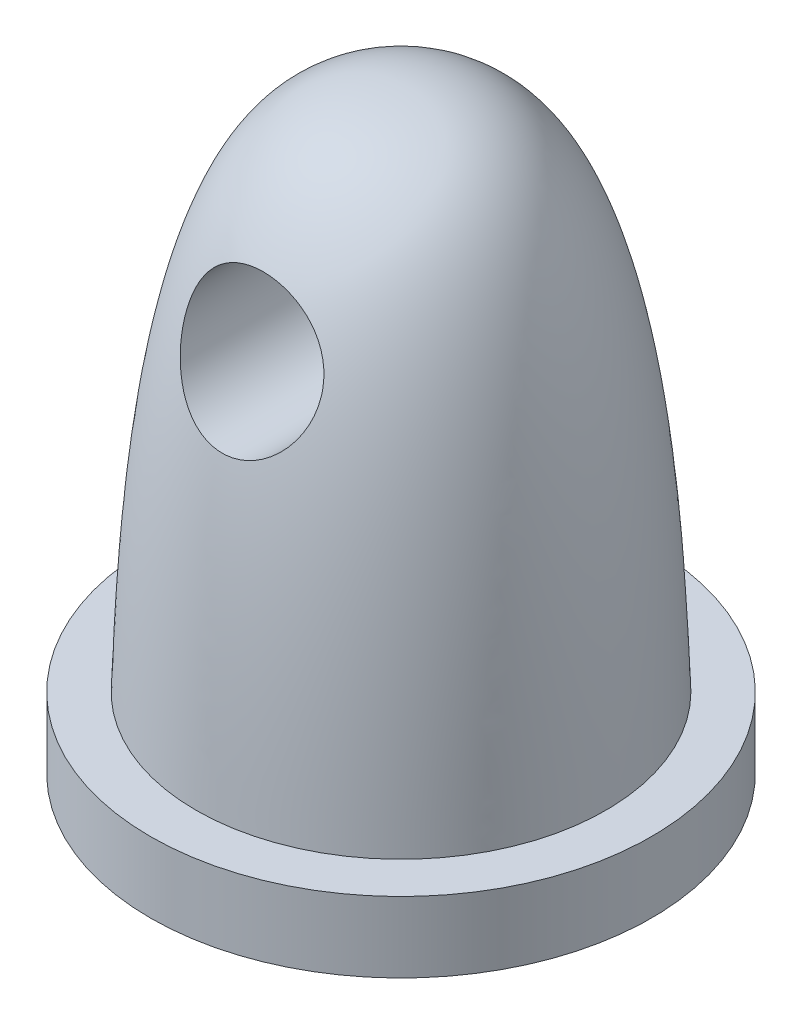
ISO-10303-21;
HEADER;
FILE_DESCRIPTION(('STEP AP214'),'2;1');
FILE_NAME('part.step','',(''),(''),'','','');
FILE_SCHEMA(('AUTOMOTIVE_DESIGN { 1 0 10303 214 1 1 1 1 }'));
ENDSEC;
DATA;
#1=APPLICATION_CONTEXT('core data for automotive mechanical design processes');
#2=APPLICATION_PROTOCOL_DEFINITION('international standard','automotive_design',2000,#1);
#3=PRODUCT_CONTEXT('',#1,'mechanical');
#4=PRODUCT('Part','Part','',(#3));
#5=PRODUCT_RELATED_PRODUCT_CATEGORY('part','',(#4));
#6=PRODUCT_DEFINITION_FORMATION('','',#4);
#7=PRODUCT_DEFINITION_CONTEXT('part definition',#1,'design');
#8=PRODUCT_DEFINITION('design','',#6,#7);
#9=PRODUCT_DEFINITION_SHAPE('','',#8);
#10=(LENGTH_UNIT() NAMED_UNIT(*) SI_UNIT(.MILLI.,.METRE.));
#11=(NAMED_UNIT(*) PLANE_ANGLE_UNIT() SI_UNIT($,.RADIAN.));
#12=(NAMED_UNIT(*) SI_UNIT($,.STERADIAN.) SOLID_ANGLE_UNIT());
#13=UNCERTAINTY_MEASURE_WITH_UNIT(LENGTH_MEASURE(1.E-05),#10,'distance_accuracy_value','');
#14=(GEOMETRIC_REPRESENTATION_CONTEXT(3) GLOBAL_UNCERTAINTY_ASSIGNED_CONTEXT((#13)) GLOBAL_UNIT_ASSIGNED_CONTEXT((#10,
#11,#12)) REPRESENTATION_CONTEXT('',''));
#15=CARTESIAN_POINT('',(0.,0.,0.));
#16=DIRECTION('',(0.,0.,1.));
#17=DIRECTION('',(1.,0.,0.));
#18=AXIS2_PLACEMENT_3D('',#15,#16,#17);
#19=CARTESIAN_POINT('',(0.,1.55,0.));
#20=DIRECTION('',(0.,1.,0.));
#21=DIRECTION('',(0.,0.,1.));
#22=AXIS2_PLACEMENT_3D('',#19,#20,#21);
#23=PLANE('',#22);
#24=CARTESIAN_POINT('',(0.,1.55,0.));
#25=DIRECTION('',(0.,1.,0.));
#26=DIRECTION('',(0.,0.,1.));
#27=AXIS2_PLACEMENT_3D('',#24,#25,#26);
#28=CIRCLE('',#27,5.5);
#29=CARTESIAN_POINT('',(0.,1.55,-5.5));
#30=VERTEX_POINT('',#29);
#31=EDGE_CURVE('E11',#30,#30,#28,.T.);
#32=ORIENTED_EDGE('',*,*,#31,.T.);
#33=EDGE_LOOP('',(#32));
#34=FACE_BOUND('',#33,.T.);
#35=CARTESIAN_POINT('',(0.,1.55,0.));
#36=DIRECTION('',(0.,1.,0.));
#37=DIRECTION('',(0.,0.,1.));
#38=AXIS2_PLACEMENT_3D('',#35,#36,#37);
#39=CIRCLE('',#38,4.5);
#40=CARTESIAN_POINT('',(0.,1.55,4.5));
#41=VERTEX_POINT('',#40);
#42=EDGE_CURVE('E57',#41,#41,#39,.T.);
#43=ORIENTED_EDGE('',*,*,#42,.F.);
#44=EDGE_LOOP('',(#43));
#45=FACE_BOUND('',#44,.T.);
#46=ADVANCED_FACE('F33',(#34,#45),#23,.T.);
#47=CARTESIAN_POINT('',(0.,1.55,0.));
#48=DIRECTION('',(0.,-1.,0.));
#49=DIRECTION('',(0.,0.,-1.));
#50=AXIS2_PLACEMENT_3D('',#47,#48,#49);
#51=CYLINDRICAL_SURFACE('',#50,5.5);
#52=CARTESIAN_POINT('',(0.,0.,0.));
#53=DIRECTION('',(0.,1.,0.));
#54=DIRECTION('',(0.,0.,1.));
#55=AXIS2_PLACEMENT_3D('',#52,#53,#54);
#56=CIRCLE('',#55,5.5);
#57=CARTESIAN_POINT('',(0.,0.,-5.5));
#58=VERTEX_POINT('',#57);
#59=EDGE_CURVE('E45',#58,#58,#56,.T.);
#60=CARTESIAN_POINT('',(0.,1.55,-5.5));
#61=CARTESIAN_POINT('',(0.,1.53385416666667,-5.5));
#62=CARTESIAN_POINT('',(0.,1.51770833333333,-5.5));
#63=CARTESIAN_POINT('',(0.,1.48541666666667,-5.5));
#64=CARTESIAN_POINT('',(0.,1.46927083333333,-5.5));
#65=CARTESIAN_POINT('',(0.,1.43697916666667,-5.5));
#66=CARTESIAN_POINT('',(0.,1.42083333333333,-5.5));
#67=CARTESIAN_POINT('',(0.,1.38854166666667,-5.5));
#68=CARTESIAN_POINT('',(0.,1.37239583333333,-5.5));
#69=CARTESIAN_POINT('',(0.,1.34010416666667,-5.5));
#70=CARTESIAN_POINT('',(0.,1.32395833333333,-5.5));
#71=CARTESIAN_POINT('',(0.,1.29166666666667,-5.5));
#72=CARTESIAN_POINT('',(0.,1.27552083333333,-5.5));
#73=CARTESIAN_POINT('',(0.,1.24322916666667,-5.5));
#74=CARTESIAN_POINT('',(0.,1.22708333333333,-5.5));
#75=CARTESIAN_POINT('',(0.,1.19479166666667,-5.5));
#76=CARTESIAN_POINT('',(0.,1.17864583333333,-5.5));
#77=CARTESIAN_POINT('',(0.,1.14635416666667,-5.5));
#78=CARTESIAN_POINT('',(0.,1.13020833333333,-5.5));
#79=CARTESIAN_POINT('',(0.,1.09791666666667,-5.5));
#80=CARTESIAN_POINT('',(0.,1.08177083333333,-5.5));
#81=CARTESIAN_POINT('',(0.,1.04947916666667,-5.5));
#82=CARTESIAN_POINT('',(0.,1.03333333333333,-5.5));
#83=CARTESIAN_POINT('',(0.,1.00104166666667,-5.5));
#84=CARTESIAN_POINT('',(0.,0.984895833333333,-5.5));
#85=CARTESIAN_POINT('',(0.,0.952604166666667,-5.5));
#86=CARTESIAN_POINT('',(0.,0.936458333333333,-5.5));
#87=CARTESIAN_POINT('',(0.,0.904166666666667,-5.5));
#88=CARTESIAN_POINT('',(0.,0.888020833333333,-5.5));
#89=CARTESIAN_POINT('',(0.,0.855729166666667,-5.5));
#90=CARTESIAN_POINT('',(0.,0.839583333333333,-5.5));
#91=CARTESIAN_POINT('',(0.,0.807291666666667,-5.5));
#92=CARTESIAN_POINT('',(0.,0.791145833333333,-5.5));
#93=CARTESIAN_POINT('',(0.,0.758854166666667,-5.5));
#94=CARTESIAN_POINT('',(0.,0.742708333333333,-5.5));
#95=CARTESIAN_POINT('',(0.,0.710416666666667,-5.5));
#96=CARTESIAN_POINT('',(0.,0.694270833333333,-5.5));
#97=CARTESIAN_POINT('',(0.,0.661979166666667,-5.5));
#98=CARTESIAN_POINT('',(0.,0.645833333333333,-5.5));
#99=CARTESIAN_POINT('',(0.,0.613541666666667,-5.5));
#100=CARTESIAN_POINT('',(0.,0.597395833333333,-5.5));
#101=CARTESIAN_POINT('',(0.,0.565104166666667,-5.5));
#102=CARTESIAN_POINT('',(0.,0.548958333333333,-5.5));
#103=CARTESIAN_POINT('',(0.,0.516666666666667,-5.5));
#104=CARTESIAN_POINT('',(0.,0.500520833333333,-5.5));
#105=CARTESIAN_POINT('',(0.,0.468229166666667,-5.5));
#106=CARTESIAN_POINT('',(0.,0.452083333333333,-5.5));
#107=CARTESIAN_POINT('',(0.,0.419791666666667,-5.5));
#108=CARTESIAN_POINT('',(0.,0.403645833333333,-5.5));
#109=CARTESIAN_POINT('',(0.,0.371354166666667,-5.5));
#110=CARTESIAN_POINT('',(0.,0.355208333333333,-5.5));
#111=CARTESIAN_POINT('',(0.,0.322916666666667,-5.5));
#112=CARTESIAN_POINT('',(0.,0.306770833333333,-5.5));
#113=CARTESIAN_POINT('',(0.,0.274479166666667,-5.5));
#114=CARTESIAN_POINT('',(0.,0.258333333333333,-5.5));
#115=CARTESIAN_POINT('',(0.,0.226041666666667,-5.5));
#116=CARTESIAN_POINT('',(0.,0.209895833333333,-5.5));
#117=CARTESIAN_POINT('',(0.,0.177604166666667,-5.5));
#118=CARTESIAN_POINT('',(0.,0.161458333333333,-5.5));
#119=CARTESIAN_POINT('',(0.,0.129166666666667,-5.5));
#120=CARTESIAN_POINT('',(0.,0.113020833333333,-5.5));
#121=CARTESIAN_POINT('',(0.,0.0807291666666667,-5.5));
#122=CARTESIAN_POINT('',(0.,0.0645833333333334,-5.5));
#123=CARTESIAN_POINT('',(0.,0.0322916666666667,-5.5));
#124=CARTESIAN_POINT('',(0.,0.0161458333333334,-5.5));
#125=CARTESIAN_POINT('',(0.,0.,-5.5));
#126=B_SPLINE_CURVE_WITH_KNOTS('',3,(#60,#61,#62,#63,#64,#65,#66,#67,#68,#69,#70,#71,#72,#73,
#74,#75,#76,#77,#78,#79,#80,#81,#82,#83,#84,#85,#86,#87,#88,#89,#90,#91,#92,#93,#94,#95,#96,#97,
#98,#99,#100,#101,#102,#103,#104,#105,#106,#107,#108,#109,#110,#111,#112,#113,#114,#115,#116,
#117,#118,#119,#120,#121,#122,#123,#124,#125),.UNSPECIFIED.,.F.,.F.,(4,2,2,2,2,2,2,2,2,2,2,2,2,
2,2,2,2,2,2,2,2,2,2,2,2,2,2,2,2,2,2,2,4),(0.,0.0484375000000001,0.0968750000000002,0.1453125,
0.19375,0.2421875,0.290625,0.3390625,0.3875,0.4359375,0.484375,0.5328125,0.58125,0.6296875,
0.678125,0.7265625,0.775,0.8234375,0.871875,0.9203125,0.96875,1.0171875,1.065625,1.1140625,
1.1625,1.2109375,1.259375,1.3078125,1.35625,1.4046875,1.453125,1.5015625,1.55),.UNSPECIFIED.);
#127=EDGE_CURVE('BSEAM35',#30,#58,#126,.T.);
#128=ORIENTED_EDGE('',*,*,#31,.F.);
#129=ORIENTED_EDGE('',*,*,#59,.T.);
#130=ORIENTED_EDGE('',*,*,#127,.T.);
#131=ORIENTED_EDGE('',*,*,#127,.F.);
#132=EDGE_LOOP('',(#128,#130,#129,#131));
#133=FACE_BOUND('',#132,.T.);
#134=ADVANCED_FACE('F35',(#133),#51,.T.);
#135=CARTESIAN_POINT('',(0.,0.,0.));
#136=DIRECTION('',(0.,1.,0.));
#137=DIRECTION('',(0.,0.,1.));
#138=AXIS2_PLACEMENT_3D('',#135,#136,#137);
#139=PLANE('',#138);
#140=ORIENTED_EDGE('',*,*,#59,.F.);
#141=EDGE_LOOP('',(#140));
#142=FACE_BOUND('',#141,.T.);
#143=ADVANCED_FACE('F53',(#142),#139,.F.);
#144=CARTESIAN_POINT('',(-4.5,1.55,0.));
#145=CARTESIAN_POINT('',(-4.41821284922061,3.53361375075111,0.));
#146=CARTESIAN_POINT('',(-4.25812384933478,10.3204827075285,0.));
#147=CARTESIAN_POINT('',(-1.72139415805613,13.0435728465028,0.));
#148=CARTESIAN_POINT('',(0.,13.05,0.));
#149=B_SPLINE_CURVE_WITH_KNOTS('',3,(#144,#145,#146,#147,#148),.UNSPECIFIED.,.F.,.F.,(4,1,4),
(0.,0.654562442987202,1.),.UNSPECIFIED.);
#150=CARTESIAN_POINT('',(0.,13.7025,0.));
#151=DIRECTION('',(0.,1.,0.));
#152=AXIS1_PLACEMENT('',#150,#151);
#153=SURFACE_OF_REVOLUTION('',#149,#152);
#154=CARTESIAN_POINT('',(1.5,9.55,-3.24777341395405));
#155=CARTESIAN_POINT('',(1.500000532154,9.63019520103539,-3.2226586680426));
#156=CARTESIAN_POINT('',(1.4935579381994,9.71096569009782,-3.19938463319633));
#157=CARTESIAN_POINT('',(1.46738959853547,9.87151715150215,-3.15731953986771));
#158=CARTESIAN_POINT('',(1.44767000870518,9.95129856497837,-3.13852640927981));
#159=CARTESIAN_POINT('',(1.39495737057765,10.1075912124798,-3.10573152383056));
#160=CARTESIAN_POINT('',(1.36193729323192,10.1840954342558,-3.09173963385722));
#161=CARTESIAN_POINT('',(1.28328617161267,10.3311051949352,-3.06838073062989));
#162=CARTESIAN_POINT('',(1.23765407299981,10.4016102316743,-3.05901410422104));
#163=CARTESIAN_POINT('',(1.13647274478337,10.5323819216922,-3.04438633292884));
#164=CARTESIAN_POINT('',(1.08123808734426,10.5928805362964,-3.03901725749909));
#165=CARTESIAN_POINT('',(0.961556072464706,10.7041611157343,-3.03101238849927));
#166=CARTESIAN_POINT('',(0.89710821794108,10.7549425559475,-3.02837674247034));
#167=CARTESIAN_POINT('',(0.759930884762748,10.8459017889838,-3.02479415988183));
#168=CARTESIAN_POINT('',(0.687109154882182,10.8859412306482,-3.02386842922822));
#169=CARTESIAN_POINT('',(0.535855759604821,10.9534668839033,-3.02286530307983));
#170=CARTESIAN_POINT('',(0.457423764890873,10.9809523578876,-3.02278795742565));
#171=CARTESIAN_POINT('',(0.295826995834769,11.0229441588308,-3.02284157992883));
#172=CARTESIAN_POINT('',(0.212606951103888,11.037238109558,-3.02297586551377));
#173=CARTESIAN_POINT('',(0.0449475748775569,11.0516857212175,-3.02311221451575));
#174=CARTESIAN_POINT('',(-0.0394917884810508,11.0518390119557,-3.02311427447121));
#175=CARTESIAN_POINT('',(-0.207401313283949,11.0379843664564,-3.02298233114689));
#176=CARTESIAN_POINT('',(-0.290868731829578,11.0239431612942,-3.02284800821095));
#177=CARTESIAN_POINT('',(-0.454265000823126,10.982046467125,-3.02278451576845));
#178=CARTESIAN_POINT('',(-0.534193715080112,10.9541904469424,-3.02285535415079));
#179=CARTESIAN_POINT('',(-0.68823459828978,10.8854571615469,-3.02387482507251));
#180=CARTESIAN_POINT('',(-0.762346988498024,10.8445803919488,-3.0248234242039));
#181=CARTESIAN_POINT('',(-0.902628608319037,10.7509869307529,-3.02855638368138));
#182=CARTESIAN_POINT('',(-0.968798190701592,10.6982707652857,-3.03134066246238));
#183=CARTESIAN_POINT('',(-1.09082455863859,10.5830028314934,-3.03983661136997));
#184=CARTESIAN_POINT('',(-1.14675153055095,10.5205238935134,-3.04552726132691));
#185=CARTESIAN_POINT('',(-1.24724638498735,10.3874512119155,-3.06082593157503));
#186=CARTESIAN_POINT('',(-1.2918170524515,10.3168594639996,-3.07043298992839));
#187=CARTESIAN_POINT('',(-1.36765521034472,10.171380428071,-3.09401145659171));
#188=CARTESIAN_POINT('',(-1.39917255283642,10.0966082886184,-3.10789106809502));
#189=CARTESIAN_POINT('',(-1.44959369194525,9.94388673142183,-3.14024499561525));
#190=CARTESIAN_POINT('',(-1.46849708144784,9.86593721121412,-3.15871945990433));
#191=CARTESIAN_POINT('',(-1.49374040392015,9.70856198832398,-3.20008003661477));
#192=CARTESIAN_POINT('',(-1.49998452302584,9.62912958652995,-3.22299836600654));
#193=CARTESIAN_POINT('',(-1.5000154336375,9.47138342410737,-3.27238781850977));
#194=CARTESIAN_POINT('',(-1.49379820731247,9.39307003247327,-3.2988600849265));
#195=CARTESIAN_POINT('',(-1.46866486825482,9.23380926559117,-3.3562742961421));
#196=CARTESIAN_POINT('',(-1.44888365539532,9.15306595099854,-3.38739982488685));
#197=CARTESIAN_POINT('',(-1.39654432867674,8.99638705484154,-3.45111845836726));
#198=CARTESIAN_POINT('',(-1.36398024269549,8.92045373978105,-3.4837122427578));
#199=CARTESIAN_POINT('',(-1.30456437247682,8.80831045184717,-3.53388257085314));
#200=CARTESIAN_POINT('',(-1.28192507045256,8.76983272053187,-3.55150127347521));
#201=CARTESIAN_POINT('',(-1.23327269632044,8.6949975041243,-3.58645043919698));
#202=CARTESIAN_POINT('',(-1.20726282164167,8.65863805635434,-3.60378115812798));
#203=CARTESIAN_POINT('',(-1.124270730952,8.55299004671783,-3.65501042294016));
#204=CARTESIAN_POINT('',(-1.06232128188497,8.48712280706061,-3.68815017458346));
#205=CARTESIAN_POINT('',(-0.926569030648553,8.36692186191459,-3.75011844289408));
#206=CARTESIAN_POINT('',(-0.852796588297662,8.31255942185014,-3.77895764610996));
#207=CARTESIAN_POINT('',(-0.694911296642607,8.2174988754252,-3.83022110559469));
#208=CARTESIAN_POINT('',(-0.610809039121409,8.17678692958493,-3.85265185560452));
#209=CARTESIAN_POINT('',(-0.444545765339783,8.11495182484723,-3.88703974497738));
#210=CARTESIAN_POINT('',(-0.363185686625246,8.09216854815514,-3.89987650965828));
#211=CARTESIAN_POINT('',(-0.196980700595622,8.06059314265993,-3.91772282239294));
#212=CARTESIAN_POINT('',(-0.112139032948017,8.05178829655847,-3.92273948494484));
#213=CARTESIAN_POINT('',(0.0481552305466088,8.04887892190343,-3.92439512994615));
#214=CARTESIAN_POINT('',(0.123575803296422,8.05321327191191,-3.92192380782376));
#215=CARTESIAN_POINT('',(0.27244198917023,8.07303994860247,-3.91068228068342));
#216=CARTESIAN_POINT('',(0.345887767248728,8.08853134031506,-3.90191260347312));
#217=CARTESIAN_POINT('',(0.487753186922207,8.12962137180856,-3.8788681808767));
#218=CARTESIAN_POINT('',(0.556230777986691,8.15506832257655,-3.86467612678153));
#219=CARTESIAN_POINT('',(0.687861698742502,8.21505367443596,-3.83165455492688));
#220=CARTESIAN_POINT('',(0.751013607785609,8.24959449128976,-3.81282380499533));
#221=CARTESIAN_POINT('',(0.876017976920335,8.32992828334344,-3.76976674555168));
#222=CARTESIAN_POINT('',(0.937302274101752,8.37642877619225,-3.74521760403689));
#223=CARTESIAN_POINT('',(1.05143727646681,8.47748240007993,-3.69311983487406));
#224=CARTESIAN_POINT('',(1.10428162477559,8.53204154182704,-3.66556897239038));
#225=CARTESIAN_POINT('',(1.17960979926438,8.6224690034184,-3.62123516246616));
#226=CARTESIAN_POINT('',(1.20524717452981,8.65604521310912,-3.60502677710461));
#227=CARTESIAN_POINT('',(1.25351597156761,8.72509359624835,-3.57230096033916));
#228=CARTESIAN_POINT('',(1.27615022445914,8.76056393915581,-3.55578383699632));
#229=CARTESIAN_POINT('',(1.33946923452974,8.86964023258691,-3.50603280974754));
#230=CARTESIAN_POINT('',(1.37555691778003,8.94589538522529,-3.47260723799376));
#231=CARTESIAN_POINT('',(1.43606786010231,9.10778500551088,-3.40528325767189));
#232=CARTESIAN_POINT('',(1.45981100829974,9.19369855168232,-3.37144602959422));
#233=CARTESIAN_POINT('',(1.4917720062183,9.36949820085662,-3.30688151294468));
#234=CARTESIAN_POINT('',(1.49999939868194,9.45938182727804,-3.27615232383256));
#235=CARTESIAN_POINT('',(1.5,9.55,-3.24777341395405));
#236=B_SPLINE_CURVE_WITH_KNOTS('',3,(#154,#155,#156,#157,#158,#159,#160,#161,#162,#163,#164,
#165,#166,#167,#168,#169,#170,#171,#172,#173,#174,#175,#176,#177,#178,#179,#180,#181,#182,#183,
#184,#185,#186,#187,#188,#189,#190,#191,#192,#193,#194,#195,#196,#197,#198,#199,#200,#201,#202,
#203,#204,#205,#206,#207,#208,#209,#210,#211,#212,#213,#214,#215,#216,#217,#218,#219,#220,#221,
#222,#223,#224,#225,#226,#227,#228,#229,#230,#231,#232,#233,#234,#235),.UNSPECIFIED.,.T.,.F.,(4,
2,2,2,2,2,2,2,2,2,2,2,2,2,2,2,2,2,2,2,2,2,2,2,2,2,2,2,2,2,2,2,2,2,2,2,2,2,2,2,4),(0.,
0.251809030520354,0.503501390110721,0.75570783660832,1.00793537343236,1.25307795931149,
1.49823377645858,1.7464100475638,1.99460089835106,2.24672112605931,2.49884795412327,
2.75156708786761,3.00429593934645,3.25701517224227,3.50972317677603,3.76062883451496,
4.01147290256723,4.25726486616722,4.50306476230357,4.75071819461822,4.99845148907169,
5.26366527419913,5.52900311421068,5.6728388527194,5.8165391296065,6.10390713185788,
6.39054870000921,6.67689877316587,6.93180508483988,7.18647935464602,7.41212651575089,
7.63775476963347,7.86007130961369,8.08244696711031,8.32375109412879,8.56523612023128,
8.7008524850802,8.8363400785353,9.10738157015746,9.39209338988749,9.67663004452561),.UNSPECIFIED.);
#237=CARTESIAN_POINT('',(1.5,9.55,-3.24777341395405));
#238=VERTEX_POINT('',#237);
#239=EDGE_CURVE('E37',#238,#238,#236,.T.);
#240=ORIENTED_EDGE('',*,*,#239,.T.);
#241=EDGE_LOOP('',(#240));
#242=FACE_BOUND('',#241,.T.);
#243=CARTESIAN_POINT('',(1.5,9.55,3.24777341395405));
#244=CARTESIAN_POINT('',(1.49999668343234,9.46015572008503,3.27591260586355));
#245=CARTESIAN_POINT('',(1.49190551855192,9.37098110039394,3.30637539398946));
#246=CARTESIAN_POINT('',(1.46044655606759,9.19646157007349,3.37039350972029));
#247=CARTESIAN_POINT('',(1.4370543487211,9.11112301198559,3.40395370501625));
#248=CARTESIAN_POINT('',(1.37602821214089,8.94649192482565,3.47230338766587));
#249=CARTESIAN_POINT('',(1.33843384832305,8.86718332772911,3.50708921864282));
#250=CARTESIAN_POINT('',(1.27211552829071,8.75398655448958,3.55881950044332));
#251=CARTESIAN_POINT('',(1.2483539206725,8.71721409191324,3.57598879623417));
#252=CARTESIAN_POINT('',(1.19758354556171,8.6457223185986,3.60997969945875));
#253=CARTESIAN_POINT('',(1.17057023618377,8.61100598312208,3.62680078119332));
#254=CARTESIAN_POINT('',(1.08300735455921,8.50819021773675,3.67741281107438));
#255=CARTESIAN_POINT('',(1.01734302525989,8.44385000653779,3.71022749311634));
#256=CARTESIAN_POINT('',(0.873977134164232,8.32743616278227,3.77096326567763));
#257=CARTESIAN_POINT('',(0.79628858290507,8.27534942335582,3.79888957675923));
#258=CARTESIAN_POINT('',(0.675389829075261,8.20994429761367,3.83448027490308));
#259=CARTESIAN_POINT('',(0.636058377027509,8.19082422933814,3.84497408989712));
#260=CARTESIAN_POINT('',(0.555535327743093,8.15597682233276,3.86421354187909));
#261=CARTESIAN_POINT('',(0.514345388497108,8.14024652916712,3.87296070071308));
#262=CARTESIAN_POINT('',(0.430431801794049,8.11240451745307,3.88851137302863));
#263=CARTESIAN_POINT('',(0.387709189445187,8.10029040635576,3.89531617148922));
#264=CARTESIAN_POINT('',(0.301097408195732,8.07985592070332,3.90682941899596));
#265=CARTESIAN_POINT('',(0.257208181391911,8.0715357348277,3.91153776378101));
#266=CARTESIAN_POINT('',(0.135805329016674,8.05413678946933,3.9213964139904));
#267=CARTESIAN_POINT('',(0.0574780672697451,8.04906559926472,3.92428826259927));
#268=CARTESIAN_POINT('',(-0.0988915750247741,8.0512202615807,3.92306329477684));
#269=CARTESIAN_POINT('',(-0.176934040460075,8.05844208787917,3.91894877307938));
#270=CARTESIAN_POINT('',(-0.3257971676321,8.08397750006777,3.90449976399051));
#271=CARTESIAN_POINT('',(-0.396772746058311,8.10161454405262,3.89454488676526));
#272=CARTESIAN_POINT('',(-0.534570833287692,8.14661422767698,3.86939784486914));
#273=CARTESIAN_POINT('',(-0.601392709110215,8.17397834537243,3.85420488426749));
#274=CARTESIAN_POINT('',(-0.732833842922821,8.23904318676844,3.81857331795666));
#275=CARTESIAN_POINT('',(-0.797161243078287,8.27720465638683,3.79790437376925));
#276=CARTESIAN_POINT('',(-0.918720188306421,8.36195179829195,3.75286641075844));
#277=CARTESIAN_POINT('',(-0.975936844728552,8.40855466048306,3.72848985837143));
#278=CARTESIAN_POINT('',(-1.08856275896585,8.51477035460625,3.67424242373476));
#279=CARTESIAN_POINT('',(-1.14298927149206,8.57526571591093,3.64406224511528));
#280=CARTESIAN_POINT('',(-1.24112107776216,8.70374064232498,3.58209914139983));
#281=CARTESIAN_POINT('',(-1.28482021142934,8.77172447529776,3.55031530799207));
#282=CARTESIAN_POINT('',(-1.34371530690803,8.88186608055711,3.50094307780107));
#283=CARTESIAN_POINT('',(-1.36290886966495,8.92194525284237,3.48337591575469));
#284=CARTESIAN_POINT('',(-1.39767962863238,9.00368208783331,3.44846625617448));
#285=CARTESIAN_POINT('',(-1.41326020484016,9.0453382324655,3.43112356310831));
#286=CARTESIAN_POINT('',(-1.45443170728856,9.17243890484704,3.37974218259942));
#287=CARTESIAN_POINT('',(-1.47446105983334,9.26003183762425,3.34634283533837));
#288=CARTESIAN_POINT('',(-1.49865046697083,9.43920860297961,3.28292596071496));
#289=CARTESIAN_POINT('',(-1.50270879545823,9.53081427229608,3.2529312896934));
#290=CARTESIAN_POINT('',(-1.49375757492605,9.71475125375644,3.198133852399));
#291=CARTESIAN_POINT('',(-1.48076113162872,9.80708195457614,3.17332711643912));
#292=CARTESIAN_POINT('',(-1.43918249792458,9.98138772507054,3.13170327721023));
#293=CARTESIAN_POINT('',(-1.41200554605574,10.0635799198377,3.11438915077343));
#294=CARTESIAN_POINT('',(-1.3434392912308,10.2228111432141,3.08501478804509));
#295=CARTESIAN_POINT('',(-1.30205470494628,10.2998518718863,3.07295281114778));
#296=CARTESIAN_POINT('',(-1.20932245699542,10.4411892629944,3.05414180371535));
#297=CARTESIAN_POINT('',(-1.15879686704359,10.5059887253671,3.04709848580883));
#298=CARTESIAN_POINT('',(-1.04768377006942,10.6266064625685,3.03624236021812));
#299=CARTESIAN_POINT('',(-0.987096127350822,10.6824246162557,3.03242959610523));
#300=CARTESIAN_POINT('',(-0.857374941735463,10.7835691570032,3.02700201255173));
#301=CARTESIAN_POINT('',(-0.788218550478052,10.8288665254753,3.02539321370779));
#302=CARTESIAN_POINT('',(-0.643398342267325,10.9075084616135,3.02340550774843));
#303=CARTESIAN_POINT('',(-0.567734091512808,10.9408522317092,3.02302668268598));
#304=CARTESIAN_POINT('',(-0.410495532050369,10.9951782956793,3.0227364484934));
#305=CARTESIAN_POINT('',(-0.328837073225526,11.015917367314,3.02283392676102));
#306=CARTESIAN_POINT('',(-0.163201766374644,11.0434571916718,3.02301666690385));
#307=CARTESIAN_POINT('',(-0.0792248399663439,11.050257472569,3.02310192836544));
#308=CARTESIAN_POINT('',(0.0890664790774516,11.0497264078194,3.02309627372996));
#309=CARTESIAN_POINT('',(0.173380678174316,11.0423309406175,3.02300455822605));
#310=CARTESIAN_POINT('',(0.339573027587944,11.013490179776,3.02282305852778));
#311=CARTESIAN_POINT('',(0.421451102612284,10.9920444523607,3.02273327439315));
#312=CARTESIAN_POINT('',(0.580453414445256,10.9357086024081,3.02307691215553));
#313=CARTESIAN_POINT('',(0.657577156481112,10.9008170833279,3.0235103884108));
#314=CARTESIAN_POINT('',(0.804859650569994,10.8185871591314,3.02573196573763));
#315=CARTESIAN_POINT('',(0.875018515993931,10.771248956662,3.02752004475552));
#316=CARTESIAN_POINT('',(1.00606664203495,10.6657402934307,3.03351136251026));
#317=CARTESIAN_POINT('',(1.06699297262473,10.6076153556388,3.03770460083659));
#318=CARTESIAN_POINT('',(1.17814067807679,10.482202447864,3.04958738239884));
#319=CARTESIAN_POINT('',(1.2283630887599,10.4149153655379,3.05727658710344));
#320=CARTESIAN_POINT('',(1.31586541537877,10.2747083679763,3.07683555869254));
#321=CARTESIAN_POINT('',(1.35336832163478,10.2019162339296,3.08862505420466));
#322=CARTESIAN_POINT('',(1.4158225260908,10.0520257308349,3.11682390846467));
#323=CARTESIAN_POINT('',(1.44078301797845,9.97493056213803,3.13322986950566));
#324=CARTESIAN_POINT('',(1.47297191712054,9.83954681614083,3.16558608865806));
#325=CARTESIAN_POINT('',(1.48314641007837,9.78168817625658,3.18050512051479));
#326=CARTESIAN_POINT('',(1.49666164790229,9.66579410768401,3.21255374468594));
#327=CARTESIAN_POINT('',(1.50000213213957,9.60775867233776,3.2296834212813));
#328=CARTESIAN_POINT('',(1.5,9.55,3.24777341395405));
#329=B_SPLINE_CURVE_WITH_KNOTS('',3,(#243,#244,#245,#246,#247,#248,#249,#250,#251,#252,#253,
#254,#255,#256,#257,#258,#259,#260,#261,#262,#263,#264,#265,#266,#267,#268,#269,#270,#271,#272,
#273,#274,#275,#276,#277,#278,#279,#280,#281,#282,#283,#284,#285,#286,#287,#288,#289,#290,#291,
#292,#293,#294,#295,#296,#297,#298,#299,#300,#301,#302,#303,#304,#305,#306,#307,#308,#309,#310,
#311,#312,#313,#314,#315,#316,#317,#318,#319,#320,#321,#322,#323,#324,#325,#326,#327,#328),
.UNSPECIFIED.,.T.,.F.,(4,2,2,2,2,2,2,2,2,2,2,2,2,2,2,2,2,2,2,2,2,2,2,2,2,2,2,2,2,2,2,2,2,2,2,2,
2,2,2,2,2,2,4),(0.,0.282205443838397,0.564862191440541,0.846737231536856,0.987684943670339,
1.1288318632402,1.42007752290117,1.71101022192776,1.84576761607606,1.98040708000496,
2.11495726492788,2.24951414057157,2.48379180342791,2.71799275017268,2.93843489255103,
3.15891054605555,3.39076965986429,3.62310634704277,3.88244303520318,4.14192829799927,
4.28513423340827,4.42820565234825,4.71428994418775,5.00219350485751,5.28987595582857,
5.55332294416801,5.81668255742395,6.06293028558652,6.3091813349016,6.55610373855659,
6.80304261435171,7.05460655306019,7.30617900702891,7.55889047694429,7.81160974922725,
8.06435527719357,8.31709669041496,8.56879477027101,8.82046848217512,9.06746935992926,
9.31428891903145,9.49570492221919,9.67712784394576),.UNSPECIFIED.);
#330=CARTESIAN_POINT('',(1.5,9.55,3.24777341395405));
#331=VERTEX_POINT('',#330);
#332=EDGE_CURVE('E63',#331,#331,#329,.T.);
#333=ORIENTED_EDGE('',*,*,#332,.T.);
#334=EDGE_LOOP('',(#333));
#335=FACE_BOUND('',#334,.T.);
#336=CARTESIAN_POINT('',(0.,13.05,0.));
#337=VERTEX_POINT('',#336);
#338=VERTEX_LOOP('',#337);
#339=FACE_BOUND('',#338,.T.);
#340=ORIENTED_EDGE('',*,*,#42,.T.);
#341=EDGE_LOOP('',(#340));
#342=FACE_BOUND('',#341,.T.);
#343=ADVANCED_FACE('F49',(#242,#335,#339,#342),#153,.T.);
#344=CARTESIAN_POINT('',(0.,9.55,-5.));
#345=DIRECTION('',(0.,0.,1.));
#346=DIRECTION('',(1.,0.,0.));
#347=AXIS2_PLACEMENT_3D('',#344,#345,#346);
#348=CYLINDRICAL_SURFACE('',#347,1.5);
#349=ORIENTED_EDGE('',*,*,#332,.F.);
#350=EDGE_LOOP('',(#349));
#351=FACE_BOUND('',#350,.T.);
#352=ORIENTED_EDGE('',*,*,#239,.F.);
#353=EDGE_LOOP('',(#352));
#354=FACE_BOUND('',#353,.T.);
#355=ADVANCED_FACE('F52',(#351,#354),#348,.F.);
#356=CLOSED_SHELL('',(#46,#134,#143,#343,#355));
#357=MANIFOLD_SOLID_BREP('B2',#356);
#358=ADVANCED_BREP_SHAPE_REPRESENTATION('',(#18,#357),#14);
#359=SHAPE_DEFINITION_REPRESENTATION(#9,#358);
ENDSEC;
END-ISO-10303-21;
